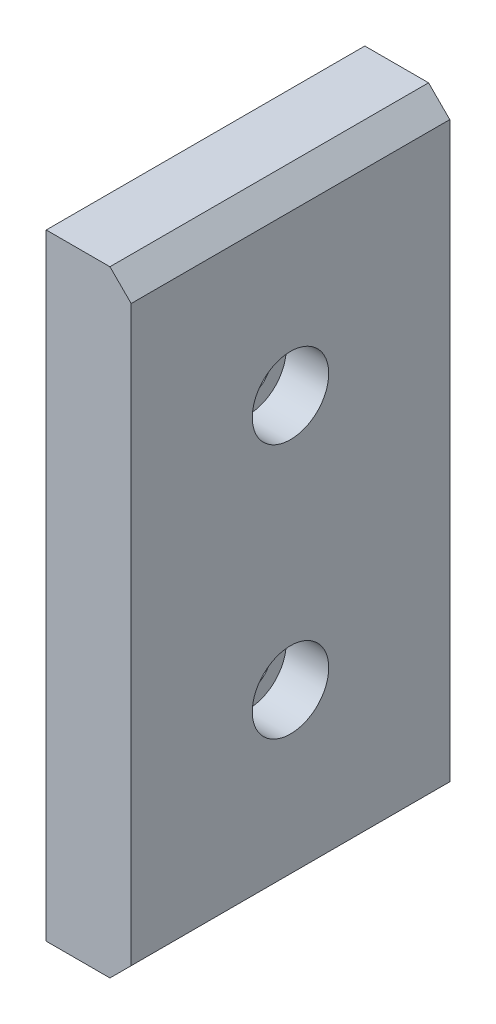
ISO-10303-21;
HEADER;
FILE_DESCRIPTION(('STEP AP214'),'2;1');
FILE_NAME('part.step','',(''),(''),'','','');
FILE_SCHEMA(('AUTOMOTIVE_DESIGN { 1 0 10303 214 1 1 1 1 }'));
ENDSEC;
DATA;
#1=APPLICATION_CONTEXT('core data for automotive mechanical design processes');
#2=APPLICATION_PROTOCOL_DEFINITION('international standard','automotive_design',2000,#1);
#3=PRODUCT_CONTEXT('',#1,'mechanical');
#4=PRODUCT('Part','Part','',(#3));
#5=PRODUCT_RELATED_PRODUCT_CATEGORY('part','',(#4));
#6=PRODUCT_DEFINITION_FORMATION('','',#4);
#7=PRODUCT_DEFINITION_CONTEXT('part definition',#1,'design');
#8=PRODUCT_DEFINITION('design','',#6,#7);
#9=PRODUCT_DEFINITION_SHAPE('','',#8);
#10=(LENGTH_UNIT() NAMED_UNIT(*) SI_UNIT(.MILLI.,.METRE.));
#11=(NAMED_UNIT(*) PLANE_ANGLE_UNIT() SI_UNIT($,.RADIAN.));
#12=(NAMED_UNIT(*) SI_UNIT($,.STERADIAN.) SOLID_ANGLE_UNIT());
#13=UNCERTAINTY_MEASURE_WITH_UNIT(LENGTH_MEASURE(1.E-05),#10,'distance_accuracy_value','');
#14=(GEOMETRIC_REPRESENTATION_CONTEXT(3) GLOBAL_UNCERTAINTY_ASSIGNED_CONTEXT((#13)) GLOBAL_UNIT_ASSIGNED_CONTEXT((#10,
#11,#12)) REPRESENTATION_CONTEXT('',''));
#15=CARTESIAN_POINT('',(0.,0.,0.));
#16=DIRECTION('',(0.,0.,1.));
#17=DIRECTION('',(1.,0.,0.));
#18=AXIS2_PLACEMENT_3D('',#15,#16,#17);
#19=CARTESIAN_POINT('',(4.,6.,0.));
#20=DIRECTION('',(-1.,0.,0.));
#21=DIRECTION('',(0.,0.,1.));
#22=AXIS2_PLACEMENT_3D('',#19,#20,#21);
#23=CYLINDRICAL_SURFACE('',#22,1.1);
#24=CARTESIAN_POINT('',(0.,6.,0.));
#25=DIRECTION('',(1.,0.,0.));
#26=DIRECTION('',(0.,0.,-1.));
#27=AXIS2_PLACEMENT_3D('',#24,#25,#26);
#28=CIRCLE('',#27,1.1);
#29=CARTESIAN_POINT('',(0.,6.,-1.1));
#30=VERTEX_POINT('',#29);
#31=EDGE_CURVE('E116',#30,#30,#28,.T.);
#32=ORIENTED_EDGE('',*,*,#31,.F.);
#33=EDGE_LOOP('',(#32));
#34=FACE_BOUND('',#33,.T.);
#35=CARTESIAN_POINT('',(2.,6.,0.));
#36=DIRECTION('',(1.,0.,0.));
#37=DIRECTION('',(0.,0.,-1.));
#38=AXIS2_PLACEMENT_3D('',#35,#36,#37);
#39=CIRCLE('',#38,1.1);
#40=CARTESIAN_POINT('',(2.,6.,-1.1));
#41=VERTEX_POINT('',#40);
#42=EDGE_CURVE('E136',#41,#41,#39,.T.);
#43=ORIENTED_EDGE('',*,*,#42,.T.);
#44=EDGE_LOOP('',(#43));
#45=FACE_BOUND('',#44,.T.);
#46=ADVANCED_FACE('F37',(#34,#45),#23,.F.);
#47=CARTESIAN_POINT('',(4.,-6.,0.));
#48=DIRECTION('',(-1.,0.,0.));
#49=DIRECTION('',(0.,0.,1.));
#50=AXIS2_PLACEMENT_3D('',#47,#48,#49);
#51=CYLINDRICAL_SURFACE('',#50,1.1);
#52=CARTESIAN_POINT('',(0.,-6.,0.));
#53=DIRECTION('',(1.,0.,0.));
#54=DIRECTION('',(0.,0.,1.));
#55=AXIS2_PLACEMENT_3D('',#52,#53,#54);
#56=CIRCLE('',#55,1.1);
#57=CARTESIAN_POINT('',(0.,-6.,1.1));
#58=VERTEX_POINT('',#57);
#59=EDGE_CURVE('E119',#58,#58,#56,.T.);
#60=ORIENTED_EDGE('',*,*,#59,.F.);
#61=EDGE_LOOP('',(#60));
#62=FACE_BOUND('',#61,.T.);
#63=CARTESIAN_POINT('',(2.,-6.,0.));
#64=DIRECTION('',(1.,0.,0.));
#65=DIRECTION('',(0.,0.,-1.));
#66=AXIS2_PLACEMENT_3D('',#63,#64,#65);
#67=CIRCLE('',#66,1.1);
#68=CARTESIAN_POINT('',(2.,-6.,-1.1));
#69=VERTEX_POINT('',#68);
#70=EDGE_CURVE('E133',#69,#69,#67,.T.);
#71=ORIENTED_EDGE('',*,*,#70,.T.);
#72=EDGE_LOOP('',(#71));
#73=FACE_BOUND('',#72,.T.);
#74=ADVANCED_FACE('F188',(#62,#73),#51,.F.);
#75=CARTESIAN_POINT('',(4.,0.,0.));
#76=DIRECTION('',(1.,0.,0.));
#77=DIRECTION('',(0.,0.,-1.));
#78=AXIS2_PLACEMENT_3D('',#75,#76,#77);
#79=PLANE('',#78);
#80=CARTESIAN_POINT('',(4.,6.,0.));
#81=DIRECTION('',(1.,0.,0.));
#82=DIRECTION('',(0.,0.,-1.));
#83=AXIS2_PLACEMENT_3D('',#80,#81,#82);
#84=CIRCLE('',#83,1.8);
#85=CARTESIAN_POINT('',(4.,6.,-1.8));
#86=VERTEX_POINT('',#85);
#87=EDGE_CURVE('E171',#86,#86,#84,.T.);
#88=ORIENTED_EDGE('',*,*,#87,.F.);
#89=EDGE_LOOP('',(#88));
#90=FACE_BOUND('',#89,.T.);
#91=CARTESIAN_POINT('',(4.,-6.,0.));
#92=DIRECTION('',(1.,0.,0.));
#93=DIRECTION('',(0.,0.,-1.));
#94=AXIS2_PLACEMENT_3D('',#91,#92,#93);
#95=CIRCLE('',#94,1.8);
#96=CARTESIAN_POINT('',(4.,-6.,-1.8));
#97=VERTEX_POINT('',#96);
#98=EDGE_CURVE('E165',#97,#97,#95,.T.);
#99=ORIENTED_EDGE('',*,*,#98,.F.);
#100=EDGE_LOOP('',(#99));
#101=FACE_BOUND('',#100,.T.);
#102=DIRECTION('',(0.,-1.,0.));
#103=VECTOR('',#102,1.);
#104=CARTESIAN_POINT('',(4.,14.5,7.5));
#105=LINE('',#104,#103);
#106=CARTESIAN_POINT('',(4.,13.5,7.5));
#107=VERTEX_POINT('',#106);
#108=CARTESIAN_POINT('',(4.,-13.5,7.5));
#109=VERTEX_POINT('',#108);
#110=EDGE_CURVE('E122',#107,#109,#105,.T.);
#111=ORIENTED_EDGE('',*,*,#110,.T.);
#112=DIRECTION('',(0.,0.,-1.));
#113=VECTOR('',#112,1.);
#114=CARTESIAN_POINT('',(4.,-13.5,-7.5));
#115=LINE('',#114,#113);
#116=CARTESIAN_POINT('',(4.,-13.5,-7.5));
#117=VERTEX_POINT('',#116);
#118=EDGE_CURVE('E142',#109,#117,#115,.T.);
#119=ORIENTED_EDGE('',*,*,#118,.T.);
#120=DIRECTION('',(0.,1.,0.));
#121=VECTOR('',#120,1.);
#122=CARTESIAN_POINT('',(4.,14.5,-7.5));
#123=LINE('',#122,#121);
#124=CARTESIAN_POINT('',(4.,13.5,-7.5));
#125=VERTEX_POINT('',#124);
#126=EDGE_CURVE('E128',#117,#125,#123,.T.);
#127=ORIENTED_EDGE('',*,*,#126,.T.);
#128=DIRECTION('',(0.,0.,1.));
#129=VECTOR('',#128,1.);
#130=CARTESIAN_POINT('',(4.,13.5,7.5));
#131=LINE('',#130,#129);
#132=EDGE_CURVE('E100',#125,#107,#131,.T.);
#133=ORIENTED_EDGE('',*,*,#132,.T.);
#134=EDGE_LOOP('',(#111,#119,#127,#133));
#135=FACE_BOUND('',#134,.T.);
#136=ADVANCED_FACE('F156',(#90,#101,#135),#79,.T.);
#137=CARTESIAN_POINT('',(0.,0.,0.));
#138=DIRECTION('',(1.,0.,0.));
#139=DIRECTION('',(0.,0.,-1.));
#140=AXIS2_PLACEMENT_3D('',#137,#138,#139);
#141=PLANE('',#140);
#142=DIRECTION('',(0.,1.,0.));
#143=VECTOR('',#142,1.);
#144=CARTESIAN_POINT('',(0.,14.5,-7.5));
#145=LINE('',#144,#143);
#146=CARTESIAN_POINT('',(0.,-14.5,-7.5));
#147=VERTEX_POINT('',#146);
#148=CARTESIAN_POINT('',(0.,14.5,-7.5));
#149=VERTEX_POINT('',#148);
#150=EDGE_CURVE('E108',#147,#149,#145,.T.);
#151=ORIENTED_EDGE('',*,*,#150,.F.);
#152=DIRECTION('',(0.,0.,-1.));
#153=VECTOR('',#152,1.);
#154=CARTESIAN_POINT('',(0.,-14.5,7.5));
#155=LINE('',#154,#153);
#156=CARTESIAN_POINT('',(0.,-14.5,7.5));
#157=VERTEX_POINT('',#156);
#158=EDGE_CURVE('E126',#157,#147,#155,.T.);
#159=ORIENTED_EDGE('',*,*,#158,.F.);
#160=DIRECTION('',(0.,-1.,0.));
#161=VECTOR('',#160,1.);
#162=CARTESIAN_POINT('',(0.,14.5,7.5));
#163=LINE('',#162,#161);
#164=CARTESIAN_POINT('',(0.,14.5,7.5));
#165=VERTEX_POINT('',#164);
#166=EDGE_CURVE('E110',#165,#157,#163,.T.);
#167=ORIENTED_EDGE('',*,*,#166,.F.);
#168=DIRECTION('',(0.,0.,1.));
#169=VECTOR('',#168,1.);
#170=CARTESIAN_POINT('',(0.,14.5,7.5));
#171=LINE('',#170,#169);
#172=EDGE_CURVE('E94',#149,#165,#171,.T.);
#173=ORIENTED_EDGE('',*,*,#172,.F.);
#174=EDGE_LOOP('',(#151,#159,#167,#173));
#175=FACE_BOUND('',#174,.T.);
#176=ORIENTED_EDGE('',*,*,#31,.T.);
#177=EDGE_LOOP('',(#176));
#178=FACE_BOUND('',#177,.T.);
#179=ORIENTED_EDGE('',*,*,#59,.T.);
#180=EDGE_LOOP('',(#179));
#181=FACE_BOUND('',#180,.T.);
#182=ADVANCED_FACE('F105',(#175,#178,#181),#141,.F.);
#183=CARTESIAN_POINT('',(4.,14.5,-7.5));
#184=DIRECTION('',(0.,0.,1.));
#185=DIRECTION('',(0.,-1.,0.));
#186=AXIS2_PLACEMENT_3D('',#183,#184,#185);
#187=PLANE('',#186);
#188=ORIENTED_EDGE('',*,*,#126,.F.);
#189=DIRECTION('',(-0.707106781186549,-0.707106781186546,0.));
#190=VECTOR('',#189,1.);
#191=CARTESIAN_POINT('',(4.,-13.5,-7.5));
#192=LINE('',#191,#190);
#193=CARTESIAN_POINT('',(3.,-14.5,-7.5));
#194=VERTEX_POINT('',#193);
#195=EDGE_CURVE('E147',#117,#194,#192,.T.);
#196=ORIENTED_EDGE('',*,*,#195,.T.);
#197=DIRECTION('',(-1.,0.,0.));
#198=VECTOR('',#197,1.);
#199=CARTESIAN_POINT('',(4.,-14.5,-7.5));
#200=LINE('',#199,#198);
#201=EDGE_CURVE('E114',#194,#147,#200,.T.);
#202=ORIENTED_EDGE('',*,*,#201,.T.);
#203=ORIENTED_EDGE('',*,*,#150,.T.);
#204=DIRECTION('',(-1.,0.,0.));
#205=VECTOR('',#204,1.);
#206=CARTESIAN_POINT('',(4.,14.5,-7.5));
#207=LINE('',#206,#205);
#208=CARTESIAN_POINT('',(3.,14.5,-7.5));
#209=VERTEX_POINT('',#208);
#210=EDGE_CURVE('E91',#209,#149,#207,.T.);
#211=ORIENTED_EDGE('',*,*,#210,.F.);
#212=DIRECTION('',(0.707106781186549,-0.707106781186546,0.));
#213=VECTOR('',#212,1.);
#214=CARTESIAN_POINT('',(4.,13.5,-7.5));
#215=LINE('',#214,#213);
#216=EDGE_CURVE('E145',#209,#125,#215,.T.);
#217=ORIENTED_EDGE('',*,*,#216,.T.);
#218=EDGE_LOOP('',(#188,#196,#202,#203,#211,#217));
#219=FACE_BOUND('',#218,.T.);
#220=ADVANCED_FACE('F113',(#219),#187,.F.);
#221=CARTESIAN_POINT('',(4.,14.5,7.5));
#222=DIRECTION('',(0.,-1.,0.));
#223=DIRECTION('',(0.,0.,-1.));
#224=AXIS2_PLACEMENT_3D('',#221,#222,#223);
#225=PLANE('',#224);
#226=DIRECTION('',(-1.,0.,0.));
#227=VECTOR('',#226,1.);
#228=CARTESIAN_POINT('',(4.,14.5,7.5));
#229=LINE('',#228,#227);
#230=CARTESIAN_POINT('',(3.,14.5,7.5));
#231=VERTEX_POINT('',#230);
#232=EDGE_CURVE('E101',#231,#165,#229,.T.);
#233=ORIENTED_EDGE('',*,*,#232,.F.);
#234=DIRECTION('',(0.,0.,-1.));
#235=VECTOR('',#234,1.);
#236=CARTESIAN_POINT('',(3.,14.5,-7.5));
#237=LINE('',#236,#235);
#238=EDGE_CURVE('E11',#231,#209,#237,.T.);
#239=ORIENTED_EDGE('',*,*,#238,.T.);
#240=ORIENTED_EDGE('',*,*,#210,.T.);
#241=ORIENTED_EDGE('',*,*,#172,.T.);
#242=EDGE_LOOP('',(#233,#239,#240,#241));
#243=FACE_BOUND('',#242,.T.);
#244=ADVANCED_FACE('F93',(#243),#225,.F.);
#245=CARTESIAN_POINT('',(4.,14.5,7.5));
#246=DIRECTION('',(0.,0.,-1.));
#247=DIRECTION('',(0.,1.,0.));
#248=AXIS2_PLACEMENT_3D('',#245,#246,#247);
#249=PLANE('',#248);
#250=DIRECTION('',(-1.,0.,0.));
#251=VECTOR('',#250,1.);
#252=CARTESIAN_POINT('',(4.,-14.5,7.5));
#253=LINE('',#252,#251);
#254=CARTESIAN_POINT('',(3.,-14.5,7.5));
#255=VERTEX_POINT('',#254);
#256=EDGE_CURVE('E130',#255,#157,#253,.T.);
#257=ORIENTED_EDGE('',*,*,#256,.F.);
#258=DIRECTION('',(0.707106781186549,0.707106781186546,0.));
#259=VECTOR('',#258,1.);
#260=CARTESIAN_POINT('',(4.,-13.5,7.5));
#261=LINE('',#260,#259);
#262=EDGE_CURVE('E46',#255,#109,#261,.T.);
#263=ORIENTED_EDGE('',*,*,#262,.T.);
#264=ORIENTED_EDGE('',*,*,#110,.F.);
#265=DIRECTION('',(-0.707106781186549,0.707106781186546,0.));
#266=VECTOR('',#265,1.);
#267=CARTESIAN_POINT('',(4.,13.5,7.5));
#268=LINE('',#267,#266);
#269=EDGE_CURVE('E53',#107,#231,#268,.T.);
#270=ORIENTED_EDGE('',*,*,#269,.T.);
#271=ORIENTED_EDGE('',*,*,#232,.T.);
#272=ORIENTED_EDGE('',*,*,#166,.T.);
#273=EDGE_LOOP('',(#257,#263,#264,#270,#271,#272));
#274=FACE_BOUND('',#273,.T.);
#275=ADVANCED_FACE('F152',(#274),#249,.F.);
#276=CARTESIAN_POINT('',(4.,-14.5,7.5));
#277=DIRECTION('',(0.,1.,0.));
#278=DIRECTION('',(0.,0.,1.));
#279=AXIS2_PLACEMENT_3D('',#276,#277,#278);
#280=PLANE('',#279);
#281=ORIENTED_EDGE('',*,*,#201,.F.);
#282=DIRECTION('',(0.,0.,1.));
#283=VECTOR('',#282,1.);
#284=CARTESIAN_POINT('',(3.,-14.5,7.5));
#285=LINE('',#284,#283);
#286=EDGE_CURVE('E61',#194,#255,#285,.T.);
#287=ORIENTED_EDGE('',*,*,#286,.T.);
#288=ORIENTED_EDGE('',*,*,#256,.T.);
#289=ORIENTED_EDGE('',*,*,#158,.T.);
#290=EDGE_LOOP('',(#281,#287,#288,#289));
#291=FACE_BOUND('',#290,.T.);
#292=ADVANCED_FACE('F160',(#291),#280,.F.);
#293=CARTESIAN_POINT('',(2.,-6.,0.));
#294=DIRECTION('',(1.,0.,0.));
#295=DIRECTION('',(0.,0.,-1.));
#296=AXIS2_PLACEMENT_3D('',#293,#294,#295);
#297=CYLINDRICAL_SURFACE('',#296,1.8);
#298=CARTESIAN_POINT('',(2.,-6.,0.));
#299=DIRECTION('',(1.,0.,0.));
#300=DIRECTION('',(0.,0.,-1.));
#301=AXIS2_PLACEMENT_3D('',#298,#299,#300);
#302=CIRCLE('',#301,1.8);
#303=CARTESIAN_POINT('',(2.,-6.,-1.8));
#304=VERTEX_POINT('',#303);
#305=EDGE_CURVE('E168',#304,#304,#302,.T.);
#306=ORIENTED_EDGE('',*,*,#305,.F.);
#307=EDGE_LOOP('',(#306));
#308=FACE_BOUND('',#307,.T.);
#309=ORIENTED_EDGE('',*,*,#98,.T.);
#310=EDGE_LOOP('',(#309));
#311=FACE_BOUND('',#310,.T.);
#312=ADVANCED_FACE('F192',(#308,#311),#297,.F.);
#313=CARTESIAN_POINT('',(2.,-6.,0.));
#314=DIRECTION('',(1.,0.,0.));
#315=DIRECTION('',(0.,0.,-1.));
#316=AXIS2_PLACEMENT_3D('',#313,#314,#315);
#317=PLANE('',#316);
#318=ORIENTED_EDGE('',*,*,#70,.F.);
#319=EDGE_LOOP('',(#318));
#320=FACE_BOUND('',#319,.T.);
#321=ORIENTED_EDGE('',*,*,#305,.T.);
#322=EDGE_LOOP('',(#321));
#323=FACE_BOUND('',#322,.T.);
#324=ADVANCED_FACE('F182',(#320,#323),#317,.T.);
#325=CARTESIAN_POINT('',(2.,6.,0.));
#326=DIRECTION('',(1.,0.,0.));
#327=DIRECTION('',(0.,0.,-1.));
#328=AXIS2_PLACEMENT_3D('',#325,#326,#327);
#329=CYLINDRICAL_SURFACE('',#328,1.8);
#330=CARTESIAN_POINT('',(2.,6.,0.));
#331=DIRECTION('',(1.,0.,0.));
#332=DIRECTION('',(0.,0.,-1.));
#333=AXIS2_PLACEMENT_3D('',#330,#331,#332);
#334=CIRCLE('',#333,1.8);
#335=CARTESIAN_POINT('',(2.,6.,-1.8));
#336=VERTEX_POINT('',#335);
#337=EDGE_CURVE('E137',#336,#336,#334,.T.);
#338=ORIENTED_EDGE('',*,*,#337,.F.);
#339=EDGE_LOOP('',(#338));
#340=FACE_BOUND('',#339,.T.);
#341=ORIENTED_EDGE('',*,*,#87,.T.);
#342=EDGE_LOOP('',(#341));
#343=FACE_BOUND('',#342,.T.);
#344=ADVANCED_FACE('F179',(#340,#343),#329,.F.);
#345=CARTESIAN_POINT('',(2.,6.,0.));
#346=DIRECTION('',(1.,0.,0.));
#347=DIRECTION('',(0.,0.,-1.));
#348=AXIS2_PLACEMENT_3D('',#345,#346,#347);
#349=PLANE('',#348);
#350=ORIENTED_EDGE('',*,*,#42,.F.);
#351=EDGE_LOOP('',(#350));
#352=FACE_BOUND('',#351,.T.);
#353=ORIENTED_EDGE('',*,*,#337,.T.);
#354=EDGE_LOOP('',(#353));
#355=FACE_BOUND('',#354,.T.);
#356=ADVANCED_FACE('F177',(#352,#355),#349,.T.);
#357=CARTESIAN_POINT('',(4.,-13.5,0.));
#358=DIRECTION('',(0.707106781186546,-0.707106781186549,0.));
#359=DIRECTION('',(0.,0.,1.));
#360=AXIS2_PLACEMENT_3D('',#357,#358,#359);
#361=PLANE('',#360);
#362=ORIENTED_EDGE('',*,*,#262,.F.);
#363=ORIENTED_EDGE('',*,*,#286,.F.);
#364=ORIENTED_EDGE('',*,*,#195,.F.);
#365=ORIENTED_EDGE('',*,*,#118,.F.);
#366=EDGE_LOOP('',(#362,#363,#364,#365));
#367=FACE_BOUND('',#366,.T.);
#368=ADVANCED_FACE('F159',(#367),#361,.T.);
#369=CARTESIAN_POINT('',(4.,13.5,0.));
#370=DIRECTION('',(0.707106781186546,0.707106781186549,0.));
#371=DIRECTION('',(0.,0.,-1.));
#372=AXIS2_PLACEMENT_3D('',#369,#370,#371);
#373=PLANE('',#372);
#374=ORIENTED_EDGE('',*,*,#216,.F.);
#375=ORIENTED_EDGE('',*,*,#238,.F.);
#376=ORIENTED_EDGE('',*,*,#269,.F.);
#377=ORIENTED_EDGE('',*,*,#132,.F.);
#378=EDGE_LOOP('',(#374,#375,#376,#377));
#379=FACE_BOUND('',#378,.T.);
#380=ADVANCED_FACE('F40',(#379),#373,.T.);
#381=CLOSED_SHELL('',(#46,#74,#136,#182,#220,#244,#275,#292,#312,#324,#344,#356,#368,#380));
#382=MANIFOLD_SOLID_BREP('B2',#381);
#383=ADVANCED_BREP_SHAPE_REPRESENTATION('',(#18,#382),#14);
#384=SHAPE_DEFINITION_REPRESENTATION(#9,#383);
ENDSEC;
END-ISO-10303-21;
